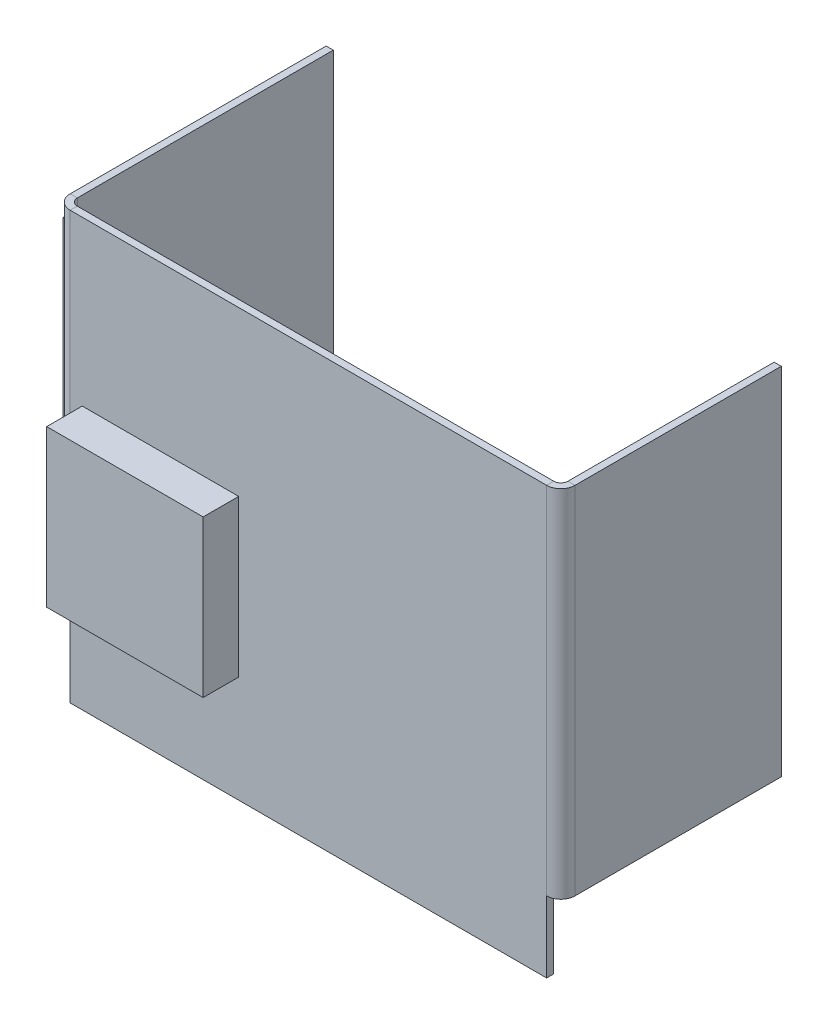
ISO-10303-21;
HEADER;
FILE_DESCRIPTION(('STEP AP214'),'2;1');
FILE_NAME('part.step','',(''),(''),'','','');
FILE_SCHEMA(('AUTOMOTIVE_DESIGN { 1 0 10303 214 1 1 1 1 }'));
ENDSEC;
DATA;
#1=APPLICATION_CONTEXT('core data for automotive mechanical design processes');
#2=APPLICATION_PROTOCOL_DEFINITION('international standard','automotive_design',2000,#1);
#3=PRODUCT_CONTEXT('',#1,'mechanical');
#4=PRODUCT('Part','Part','',(#3));
#5=PRODUCT_RELATED_PRODUCT_CATEGORY('part','',(#4));
#6=PRODUCT_DEFINITION_FORMATION('','',#4);
#7=PRODUCT_DEFINITION_CONTEXT('part definition',#1,'design');
#8=PRODUCT_DEFINITION('design','',#6,#7);
#9=PRODUCT_DEFINITION_SHAPE('','',#8);
#10=(LENGTH_UNIT() NAMED_UNIT(*) SI_UNIT(.MILLI.,.METRE.));
#11=(NAMED_UNIT(*) PLANE_ANGLE_UNIT() SI_UNIT($,.RADIAN.));
#12=(NAMED_UNIT(*) SI_UNIT($,.STERADIAN.) SOLID_ANGLE_UNIT());
#13=UNCERTAINTY_MEASURE_WITH_UNIT(LENGTH_MEASURE(1.E-05),#10,'distance_accuracy_value','');
#14=(GEOMETRIC_REPRESENTATION_CONTEXT(3) GLOBAL_UNCERTAINTY_ASSIGNED_CONTEXT((#13)) GLOBAL_UNIT_ASSIGNED_CONTEXT((#10,
#11,#12)) REPRESENTATION_CONTEXT('',''));
#15=CARTESIAN_POINT('',(0.,0.,0.));
#16=DIRECTION('',(0.,0.,1.));
#17=DIRECTION('',(1.,0.,0.));
#18=AXIS2_PLACEMENT_3D('',#15,#16,#17);
#19=CARTESIAN_POINT('',(-0.1,6.,0.));
#20=DIRECTION('',(-1.,0.,0.));
#21=DIRECTION('',(0.,0.,1.));
#22=AXIS2_PLACEMENT_3D('',#19,#20,#21);
#23=PLANE('',#22);
#24=DIRECTION('',(0.,0.,1.));
#25=VECTOR('',#24,1.);
#26=CARTESIAN_POINT('',(-0.1,1.,-3.7));
#27=LINE('',#26,#25);
#28=CARTESIAN_POINT('',(-0.1,1.,-3.7));
#29=VERTEX_POINT('',#28);
#30=CARTESIAN_POINT('',(-0.0999999999999999,1.,-0.1));
#31=VERTEX_POINT('',#30);
#32=EDGE_CURVE('E266',#29,#31,#27,.T.);
#33=ORIENTED_EDGE('',*,*,#32,.T.);
#34=DIRECTION('',(0.,-1.,0.));
#35=VECTOR('',#34,1.);
#36=CARTESIAN_POINT('',(-0.1,6.,-0.1));
#37=LINE('',#36,#35);
#38=CARTESIAN_POINT('',(-0.1,6.,-0.1));
#39=VERTEX_POINT('',#38);
#40=EDGE_CURVE('E345',#39,#31,#37,.T.);
#41=ORIENTED_EDGE('',*,*,#40,.F.);
#42=DIRECTION('',(0.,0.,-1.));
#43=VECTOR('',#42,1.);
#44=CARTESIAN_POINT('',(-0.1,6.,0.));
#45=LINE('',#44,#43);
#46=CARTESIAN_POINT('',(-0.1,6.,-3.7));
#47=VERTEX_POINT('',#46);
#48=EDGE_CURVE('E282',#39,#47,#45,.T.);
#49=ORIENTED_EDGE('',*,*,#48,.T.);
#50=DIRECTION('',(0.,-1.,0.));
#51=VECTOR('',#50,1.);
#52=CARTESIAN_POINT('',(-0.1,6.,-3.7));
#53=LINE('',#52,#51);
#54=EDGE_CURVE('E348',#47,#29,#53,.T.);
#55=ORIENTED_EDGE('',*,*,#54,.T.);
#56=EDGE_LOOP('',(#33,#41,#49,#55));
#57=FACE_BOUND('',#56,.T.);
#58=DIRECTION('',(0.,0.,1.));
#59=VECTOR('',#58,1.);
#60=CARTESIAN_POINT('',(-0.1,1.06026422059031,-3.5));
#61=LINE('',#60,#59);
#62=CARTESIAN_POINT('',(-0.1,1.06026422059031,-3.5));
#63=VERTEX_POINT('',#62);
#64=CARTESIAN_POINT('',(-0.1,1.06026422059031,-0.5));
#65=VERTEX_POINT('',#64);
#66=EDGE_CURVE('E769',#63,#65,#61,.T.);
#67=ORIENTED_EDGE('',*,*,#66,.F.);
#68=DIRECTION('',(0.,-1.,0.));
#69=VECTOR('',#68,1.);
#70=CARTESIAN_POINT('',(-0.1,5.26026422059031,-3.5));
#71=LINE('',#70,#69);
#72=CARTESIAN_POINT('',(-0.1,5.26026422059031,-3.5));
#73=VERTEX_POINT('',#72);
#74=EDGE_CURVE('E211',#73,#63,#71,.T.);
#75=ORIENTED_EDGE('',*,*,#74,.F.);
#76=DIRECTION('',(0.,0.,-1.));
#77=VECTOR('',#76,1.);
#78=CARTESIAN_POINT('',(-0.1,5.26026422059031,-3.5));
#79=LINE('',#78,#77);
#80=CARTESIAN_POINT('',(-0.1,5.26026422059031,-0.5));
#81=VERTEX_POINT('',#80);
#82=EDGE_CURVE('E207',#81,#73,#79,.T.);
#83=ORIENTED_EDGE('',*,*,#82,.F.);
#84=DIRECTION('',(0.,1.,0.));
#85=VECTOR('',#84,1.);
#86=CARTESIAN_POINT('',(-0.1,5.26026422059031,-0.5));
#87=LINE('',#86,#85);
#88=EDGE_CURVE('E766',#65,#81,#87,.T.);
#89=ORIENTED_EDGE('',*,*,#88,.F.);
#90=EDGE_LOOP('',(#67,#75,#83,#89));
#91=FACE_BOUND('',#90,.T.);
#92=ADVANCED_FACE('F39',(#57,#91),#23,.T.);
#93=CARTESIAN_POINT('',(0.,6.,0.1));
#94=DIRECTION('',(0.,0.,1.));
#95=DIRECTION('',(1.,0.,0.));
#96=AXIS2_PLACEMENT_3D('',#93,#94,#95);
#97=PLANE('',#96);
#98=DIRECTION('',(1.,0.,0.));
#99=VECTOR('',#98,1.);
#100=CARTESIAN_POINT('',(0.,0.,0.1));
#101=LINE('',#100,#99);
#102=CARTESIAN_POINT('',(6.79999999999999,0.,0.1));
#103=VERTEX_POINT('',#102);
#104=CARTESIAN_POINT('',(0.0999999999999998,0.,0.1));
#105=VERTEX_POINT('',#104);
#106=EDGE_CURVE('E275',#103,#105,#101,.F.);
#107=ORIENTED_EDGE('',*,*,#106,.F.);
#108=DIRECTION('',(0.,-1.,0.));
#109=VECTOR('',#108,1.);
#110=CARTESIAN_POINT('',(6.79999999999999,0.,0.1));
#111=LINE('',#110,#109);
#112=CARTESIAN_POINT('',(6.79999999999999,1.,0.1));
#113=VERTEX_POINT('',#112);
#114=EDGE_CURVE('E244',#113,#103,#111,.T.);
#115=ORIENTED_EDGE('',*,*,#114,.F.);
#116=DIRECTION('',(0.,-1.,0.));
#117=VECTOR('',#116,1.);
#118=CARTESIAN_POINT('',(6.79999999999999,6.,0.1));
#119=LINE('',#118,#117);
#120=CARTESIAN_POINT('',(6.79999999999999,6.,0.1));
#121=VERTEX_POINT('',#120);
#122=EDGE_CURVE('E339',#121,#113,#119,.T.);
#123=ORIENTED_EDGE('',*,*,#122,.F.);
#124=DIRECTION('',(1.,0.,0.));
#125=VECTOR('',#124,1.);
#126=CARTESIAN_POINT('',(0.,6.,0.1));
#127=LINE('',#126,#125);
#128=CARTESIAN_POINT('',(0.0999999999999998,6.,0.1));
#129=VERTEX_POINT('',#128);
#130=EDGE_CURVE('E288',#121,#129,#127,.F.);
#131=ORIENTED_EDGE('',*,*,#130,.T.);
#132=DIRECTION('',(0.,-1.,0.));
#133=VECTOR('',#132,1.);
#134=CARTESIAN_POINT('',(0.0999999999999998,6.,0.1));
#135=LINE('',#134,#133);
#136=CARTESIAN_POINT('',(0.0999999999999998,1.,0.1));
#137=VERTEX_POINT('',#136);
#138=EDGE_CURVE('E342',#129,#137,#135,.T.);
#139=ORIENTED_EDGE('',*,*,#138,.T.);
#140=DIRECTION('',(0.,1.,0.));
#141=VECTOR('',#140,1.);
#142=CARTESIAN_POINT('',(0.0999999999999998,0.,0.1));
#143=LINE('',#142,#141);
#144=EDGE_CURVE('E259',#105,#137,#143,.T.);
#145=ORIENTED_EDGE('',*,*,#144,.F.);
#146=EDGE_LOOP('',(#107,#115,#123,#131,#139,#145));
#147=FACE_BOUND('',#146,.T.);
#148=DIRECTION('',(1.,0.,0.));
#149=VECTOR('',#148,1.);
#150=CARTESIAN_POINT('',(0.269926130657873,1.5,0.1));
#151=LINE('',#150,#149);
#152=CARTESIAN_POINT('',(0.269926130657873,1.5,0.1));
#153=VERTEX_POINT('',#152);
#154=CARTESIAN_POINT('',(2.46992613065787,1.5,0.1));
#155=VERTEX_POINT('',#154);
#156=EDGE_CURVE('E216',#153,#155,#151,.T.);
#157=ORIENTED_EDGE('',*,*,#156,.F.);
#158=DIRECTION('',(0.,-1.,0.));
#159=VECTOR('',#158,1.);
#160=CARTESIAN_POINT('',(0.269926130657872,3.7,0.1));
#161=LINE('',#160,#159);
#162=CARTESIAN_POINT('',(0.269926130657872,3.7,0.1));
#163=VERTEX_POINT('',#162);
#164=EDGE_CURVE('E213',#163,#153,#161,.T.);
#165=ORIENTED_EDGE('',*,*,#164,.F.);
#166=DIRECTION('',(-1.,0.,0.));
#167=VECTOR('',#166,1.);
#168=CARTESIAN_POINT('',(0.269926130657872,3.7,0.1));
#169=LINE('',#168,#167);
#170=CARTESIAN_POINT('',(2.46992613065787,3.7,0.1));
#171=VERTEX_POINT('',#170);
#172=EDGE_CURVE('E225',#171,#163,#169,.T.);
#173=ORIENTED_EDGE('',*,*,#172,.F.);
#174=DIRECTION('',(0.,1.,0.));
#175=VECTOR('',#174,1.);
#176=CARTESIAN_POINT('',(2.46992613065787,3.7,0.1));
#177=LINE('',#176,#175);
#178=EDGE_CURVE('E233',#155,#171,#177,.T.);
#179=ORIENTED_EDGE('',*,*,#178,.F.);
#180=EDGE_LOOP('',(#157,#165,#173,#179));
#181=FACE_BOUND('',#180,.T.);
#182=ADVANCED_FACE('F420',(#147,#181),#97,.T.);
#183=CARTESIAN_POINT('',(6.79999999999999,1.,-3.7));
#184=DIRECTION('',(0.,1.,0.));
#185=DIRECTION('',(0.,0.,1.));
#186=AXIS2_PLACEMENT_3D('',#183,#184,#185);
#187=PLANE('',#186);
#188=DIRECTION('',(0.,0.,1.));
#189=VECTOR('',#188,1.);
#190=CARTESIAN_POINT('',(7.,1.,-3.7));
#191=LINE('',#190,#189);
#192=CARTESIAN_POINT('',(7.,1.,-3.));
#193=VERTEX_POINT('',#192);
#194=CARTESIAN_POINT('',(7.,1.,-0.100000000000001));
#195=VERTEX_POINT('',#194);
#196=EDGE_CURVE('E246',#193,#195,#191,.T.);
#197=ORIENTED_EDGE('',*,*,#196,.T.);
#198=DIRECTION('',(-1.,0.,0.));
#199=VECTOR('',#198,1.);
#200=CARTESIAN_POINT('',(7.,1.,-0.100000000000001));
#201=LINE('',#200,#199);
#202=CARTESIAN_POINT('',(6.9,1.,-0.0999999999999998));
#203=VERTEX_POINT('',#202);
#204=EDGE_CURVE('E12',#195,#203,#201,.T.);
#205=ORIENTED_EDGE('',*,*,#204,.T.);
#206=DIRECTION('',(0.,0.,1.));
#207=VECTOR('',#206,1.);
#208=CARTESIAN_POINT('',(6.9,1.,-3.));
#209=LINE('',#208,#207);
#210=CARTESIAN_POINT('',(6.9,1.,-3.));
#211=VERTEX_POINT('',#210);
#212=EDGE_CURVE('E250',#211,#203,#209,.T.);
#213=ORIENTED_EDGE('',*,*,#212,.F.);
#214=DIRECTION('',(1.,0.,0.));
#215=VECTOR('',#214,1.);
#216=CARTESIAN_POINT('',(6.9,1.,-3.));
#217=LINE('',#216,#215);
#218=EDGE_CURVE('E255',#211,#193,#217,.T.);
#219=ORIENTED_EDGE('',*,*,#218,.T.);
#220=EDGE_LOOP('',(#197,#205,#213,#219));
#221=FACE_BOUND('',#220,.T.);
#222=ADVANCED_FACE('F405',(#221),#187,.F.);
#223=CARTESIAN_POINT('',(0.1,6.,0.));
#224=DIRECTION('',(0.,1.,0.));
#225=DIRECTION('',(0.,0.,1.));
#226=AXIS2_PLACEMENT_3D('',#223,#224,#225);
#227=PLANE('',#226);
#228=DIRECTION('',(0.,0.,1.));
#229=VECTOR('',#228,1.);
#230=CARTESIAN_POINT('',(0.1,6.,0.));
#231=LINE('',#230,#229);
#232=CARTESIAN_POINT('',(0.1,6.,0.));
#233=VERTEX_POINT('',#232);
#234=EDGE_CURVE('E366',#233,#129,#231,.T.);
#235=ORIENTED_EDGE('',*,*,#234,.F.);
#236=CARTESIAN_POINT('',(0.1,6.,-0.1));
#237=DIRECTION('',(0.,-1.,0.));
#238=DIRECTION('',(0.,0.,-1.));
#239=AXIS2_PLACEMENT_3D('',#236,#237,#238);
#240=CIRCLE('',#239,0.1);
#241=CARTESIAN_POINT('',(0.,6.,-0.1));
#242=VERTEX_POINT('',#241);
#243=EDGE_CURVE('E309',#233,#242,#240,.T.);
#244=ORIENTED_EDGE('',*,*,#243,.T.);
#245=DIRECTION('',(1.,0.,0.));
#246=VECTOR('',#245,1.);
#247=CARTESIAN_POINT('',(-0.1,6.,-0.1));
#248=LINE('',#247,#246);
#249=EDGE_CURVE('E364',#39,#242,#248,.T.);
#250=ORIENTED_EDGE('',*,*,#249,.F.);
#251=CARTESIAN_POINT('',(0.1,6.,-0.1));
#252=DIRECTION('',(0.,1.,0.));
#253=DIRECTION('',(1.,0.,0.));
#254=AXIS2_PLACEMENT_3D('',#251,#252,#253);
#255=CIRCLE('',#254,0.2);
#256=EDGE_CURVE('E285',#129,#39,#255,.F.);
#257=ORIENTED_EDGE('',*,*,#256,.F.);
#258=EDGE_LOOP('',(#235,#244,#250,#257));
#259=FACE_BOUND('',#258,.T.);
#260=ADVANCED_FACE('F41',(#259),#227,.T.);
#261=CARTESIAN_POINT('',(-0.1,6.,-0.1));
#262=DIRECTION('',(0.,1.,0.));
#263=DIRECTION('',(0.,0.,1.));
#264=AXIS2_PLACEMENT_3D('',#261,#262,#263);
#265=PLANE('',#264);
#266=DIRECTION('',(-1.,0.,0.));
#267=VECTOR('',#266,1.);
#268=CARTESIAN_POINT('',(0.,6.,0.));
#269=LINE('',#268,#267);
#270=CARTESIAN_POINT('',(6.8,6.,0.));
#271=VERTEX_POINT('',#270);
#272=EDGE_CURVE('E306',#271,#233,#269,.T.);
#273=ORIENTED_EDGE('',*,*,#272,.T.);
#274=ORIENTED_EDGE('',*,*,#234,.T.);
#275=ORIENTED_EDGE('',*,*,#130,.F.);
#276=DIRECTION('',(0.,0.,-1.));
#277=VECTOR('',#276,1.);
#278=CARTESIAN_POINT('',(6.79999999999999,6.,0.1));
#279=LINE('',#278,#277);
#280=EDGE_CURVE('E357',#121,#271,#279,.T.);
#281=ORIENTED_EDGE('',*,*,#280,.T.);
#282=EDGE_LOOP('',(#273,#274,#275,#281));
#283=FACE_BOUND('',#282,.T.);
#284=ADVANCED_FACE('F388',(#283),#265,.T.);
#285=CARTESIAN_POINT('',(6.9,6.,-0.0999999999999998));
#286=DIRECTION('',(0.,1.,0.));
#287=DIRECTION('',(0.,0.,1.));
#288=AXIS2_PLACEMENT_3D('',#285,#286,#287);
#289=PLANE('',#288);
#290=DIRECTION('',(1.,0.,0.));
#291=VECTOR('',#290,1.);
#292=CARTESIAN_POINT('',(6.9,6.,-0.0999999999999998));
#293=LINE('',#292,#291);
#294=CARTESIAN_POINT('',(6.9,6.,-0.0999999999999998));
#295=VERTEX_POINT('',#294);
#296=CARTESIAN_POINT('',(7.,6.,-0.1));
#297=VERTEX_POINT('',#296);
#298=EDGE_CURVE('E359',#295,#297,#293,.T.);
#299=ORIENTED_EDGE('',*,*,#298,.F.);
#300=CARTESIAN_POINT('',(6.8,6.,-0.0999999999999997));
#301=DIRECTION('',(0.,-1.,0.));
#302=DIRECTION('',(0.,0.,-1.));
#303=AXIS2_PLACEMENT_3D('',#300,#301,#302);
#304=CIRCLE('',#303,0.1);
#305=EDGE_CURVE('E303',#295,#271,#304,.T.);
#306=ORIENTED_EDGE('',*,*,#305,.T.);
#307=ORIENTED_EDGE('',*,*,#280,.F.);
#308=CARTESIAN_POINT('',(6.8,6.,-0.0999999999999997));
#309=DIRECTION('',(0.,1.,0.));
#310=DIRECTION('',(1.,0.,0.));
#311=AXIS2_PLACEMENT_3D('',#308,#309,#310);
#312=CIRCLE('',#311,0.2);
#313=EDGE_CURVE('E291',#297,#121,#312,.F.);
#314=ORIENTED_EDGE('',*,*,#313,.F.);
#315=EDGE_LOOP('',(#299,#306,#307,#314));
#316=FACE_BOUND('',#315,.T.);
#317=ADVANCED_FACE('F394',(#316),#289,.T.);
#318=CARTESIAN_POINT('',(6.79999999999999,6.,0.1));
#319=DIRECTION('',(0.,1.,0.));
#320=DIRECTION('',(0.,0.,1.));
#321=AXIS2_PLACEMENT_3D('',#318,#319,#320);
#322=PLANE('',#321);
#323=DIRECTION('',(0.,0.,1.));
#324=VECTOR('',#323,1.);
#325=CARTESIAN_POINT('',(6.9,6.,-3.));
#326=LINE('',#325,#324);
#327=CARTESIAN_POINT('',(6.9,6.,-3.));
#328=VERTEX_POINT('',#327);
#329=EDGE_CURVE('E300',#328,#295,#326,.T.);
#330=ORIENTED_EDGE('',*,*,#329,.T.);
#331=ORIENTED_EDGE('',*,*,#298,.T.);
#332=DIRECTION('',(0.,0.,-1.));
#333=VECTOR('',#332,1.);
#334=CARTESIAN_POINT('',(7.,6.,-3.));
#335=LINE('',#334,#333);
#336=CARTESIAN_POINT('',(7.,6.,-3.));
#337=VERTEX_POINT('',#336);
#338=EDGE_CURVE('E294',#337,#297,#335,.F.);
#339=ORIENTED_EDGE('',*,*,#338,.F.);
#340=DIRECTION('',(1.,0.,0.));
#341=VECTOR('',#340,1.);
#342=CARTESIAN_POINT('',(6.9,6.,-3.));
#343=LINE('',#342,#341);
#344=EDGE_CURVE('E297',#328,#337,#343,.T.);
#345=ORIENTED_EDGE('',*,*,#344,.F.);
#346=EDGE_LOOP('',(#330,#331,#339,#345));
#347=FACE_BOUND('',#346,.T.);
#348=ADVANCED_FACE('F400',(#347),#322,.T.);
#349=CARTESIAN_POINT('',(7.,0.,-0.1));
#350=DIRECTION('',(0.,-1.,0.));
#351=DIRECTION('',(0.,0.,-1.));
#352=AXIS2_PLACEMENT_3D('',#349,#350,#351);
#353=PLANE('',#352);
#354=DIRECTION('',(-1.,0.,0.));
#355=VECTOR('',#354,1.);
#356=CARTESIAN_POINT('',(0.,0.,0.));
#357=LINE('',#356,#355);
#358=CARTESIAN_POINT('',(6.8,0.,0.));
#359=VERTEX_POINT('',#358);
#360=CARTESIAN_POINT('',(0.0999999999999998,0.,0.));
#361=VERTEX_POINT('',#360);
#362=EDGE_CURVE('E279',#359,#361,#357,.T.);
#363=ORIENTED_EDGE('',*,*,#362,.F.);
#364=DIRECTION('',(0.,0.,1.));
#365=VECTOR('',#364,1.);
#366=CARTESIAN_POINT('',(6.8,0.,0.));
#367=LINE('',#366,#365);
#368=EDGE_CURVE('E354',#359,#103,#367,.T.);
#369=ORIENTED_EDGE('',*,*,#368,.T.);
#370=ORIENTED_EDGE('',*,*,#106,.T.);
#371=DIRECTION('',(0.,0.,-1.));
#372=VECTOR('',#371,1.);
#373=CARTESIAN_POINT('',(0.0999999999999998,0.,0.1));
#374=LINE('',#373,#372);
#375=EDGE_CURVE('E361',#105,#361,#374,.T.);
#376=ORIENTED_EDGE('',*,*,#375,.T.);
#377=EDGE_LOOP('',(#363,#369,#370,#376));
#378=FACE_BOUND('',#377,.T.);
#379=ADVANCED_FACE('F424',(#378),#353,.T.);
#380=CARTESIAN_POINT('',(0.,6.,0.));
#381=DIRECTION('',(-1.,0.,0.));
#382=DIRECTION('',(0.,0.,1.));
#383=AXIS2_PLACEMENT_3D('',#380,#381,#382);
#384=PLANE('',#383);
#385=DIRECTION('',(0.,-1.,0.));
#386=VECTOR('',#385,1.);
#387=CARTESIAN_POINT('',(0.,6.,-0.1));
#388=LINE('',#387,#386);
#389=CARTESIAN_POINT('',(0.,1.,-0.1));
#390=VERTEX_POINT('',#389);
#391=EDGE_CURVE('E312',#242,#390,#388,.T.);
#392=ORIENTED_EDGE('',*,*,#391,.T.);
#393=DIRECTION('',(0.,0.,-1.));
#394=VECTOR('',#393,1.);
#395=CARTESIAN_POINT('',(0.,1.,0.));
#396=LINE('',#395,#394);
#397=CARTESIAN_POINT('',(0.,1.,-3.7));
#398=VERTEX_POINT('',#397);
#399=EDGE_CURVE('E269',#390,#398,#396,.T.);
#400=ORIENTED_EDGE('',*,*,#399,.T.);
#401=DIRECTION('',(0.,-1.,0.));
#402=VECTOR('',#401,1.);
#403=CARTESIAN_POINT('',(0.,6.,-3.7));
#404=LINE('',#403,#402);
#405=CARTESIAN_POINT('',(0.,6.,-3.7));
#406=VERTEX_POINT('',#405);
#407=EDGE_CURVE('E351',#406,#398,#404,.T.);
#408=ORIENTED_EDGE('',*,*,#407,.F.);
#409=DIRECTION('',(0.,0.,-1.));
#410=VECTOR('',#409,1.);
#411=CARTESIAN_POINT('',(0.,6.,0.));
#412=LINE('',#411,#410);
#413=EDGE_CURVE('E276',#242,#406,#412,.T.);
#414=ORIENTED_EDGE('',*,*,#413,.F.);
#415=EDGE_LOOP('',(#392,#400,#408,#414));
#416=FACE_BOUND('',#415,.T.);
#417=ADVANCED_FACE('F449',(#416),#384,.F.);
#418=CARTESIAN_POINT('',(-0.1,6.,-3.7));
#419=DIRECTION('',(0.,0.,-1.));
#420=DIRECTION('',(-1.,0.,0.));
#421=AXIS2_PLACEMENT_3D('',#418,#419,#420);
#422=PLANE('',#421);
#423=DIRECTION('',(-1.,0.,0.));
#424=VECTOR('',#423,1.);
#425=CARTESIAN_POINT('',(0.0999999999999998,1.,-3.7));
#426=LINE('',#425,#424);
#427=EDGE_CURVE('E260',#398,#29,#426,.T.);
#428=ORIENTED_EDGE('',*,*,#427,.T.);
#429=ORIENTED_EDGE('',*,*,#54,.F.);
#430=DIRECTION('',(1.,0.,0.));
#431=VECTOR('',#430,1.);
#432=CARTESIAN_POINT('',(-0.1,6.,-3.7));
#433=LINE('',#432,#431);
#434=EDGE_CURVE('E278',#47,#406,#433,.T.);
#435=ORIENTED_EDGE('',*,*,#434,.T.);
#436=ORIENTED_EDGE('',*,*,#407,.T.);
#437=EDGE_LOOP('',(#428,#429,#435,#436));
#438=FACE_BOUND('',#437,.T.);
#439=ADVANCED_FACE('F444',(#438),#422,.T.);
#440=CARTESIAN_POINT('',(0.1,6.,-0.1));
#441=DIRECTION('',(0.,-1.,0.));
#442=DIRECTION('',(0.,0.,-1.));
#443=AXIS2_PLACEMENT_3D('',#440,#441,#442);
#444=CYLINDRICAL_SURFACE('',#443,0.2);
#445=CARTESIAN_POINT('',(0.1,1.,-0.1));
#446=DIRECTION('',(0.,1.,0.));
#447=DIRECTION('',(0.,0.,1.));
#448=AXIS2_PLACEMENT_3D('',#445,#446,#447);
#449=CIRCLE('',#448,0.2);
#450=EDGE_CURVE('E273',#137,#31,#449,.F.);
#451=ORIENTED_EDGE('',*,*,#450,.F.);
#452=ORIENTED_EDGE('',*,*,#138,.F.);
#453=ORIENTED_EDGE('',*,*,#256,.T.);
#454=ORIENTED_EDGE('',*,*,#40,.T.);
#455=EDGE_LOOP('',(#451,#452,#453,#454));
#456=FACE_BOUND('',#455,.T.);
#457=ADVANCED_FACE('F436',(#456),#444,.T.);
#458=CARTESIAN_POINT('',(6.8,6.,-0.0999999999999997));
#459=DIRECTION('',(0.,-1.,0.));
#460=DIRECTION('',(0.,0.,-1.));
#461=AXIS2_PLACEMENT_3D('',#458,#459,#460);
#462=CYLINDRICAL_SURFACE('',#461,0.2);
#463=CARTESIAN_POINT('',(6.8,1.,-0.0999999999999997));
#464=DIRECTION('',(0.,1.,0.));
#465=DIRECTION('',(0.,0.,1.));
#466=AXIS2_PLACEMENT_3D('',#463,#464,#465);
#467=CIRCLE('',#466,0.2);
#468=EDGE_CURVE('E257',#195,#113,#467,.F.);
#469=ORIENTED_EDGE('',*,*,#468,.F.);
#470=DIRECTION('',(0.,-1.,0.));
#471=VECTOR('',#470,1.);
#472=CARTESIAN_POINT('',(7.,6.,-0.1));
#473=LINE('',#472,#471);
#474=EDGE_CURVE('E336',#297,#195,#473,.T.);
#475=ORIENTED_EDGE('',*,*,#474,.F.);
#476=ORIENTED_EDGE('',*,*,#313,.T.);
#477=ORIENTED_EDGE('',*,*,#122,.T.);
#478=EDGE_LOOP('',(#469,#475,#476,#477));
#479=FACE_BOUND('',#478,.T.);
#480=ADVANCED_FACE('F413',(#479),#462,.T.);
#481=CARTESIAN_POINT('',(7.,6.,-3.));
#482=DIRECTION('',(1.,0.,0.));
#483=DIRECTION('',(0.,0.,-1.));
#484=AXIS2_PLACEMENT_3D('',#481,#482,#483);
#485=PLANE('',#484);
#486=ORIENTED_EDGE('',*,*,#196,.F.);
#487=DIRECTION('',(0.,-1.,0.));
#488=VECTOR('',#487,1.);
#489=CARTESIAN_POINT('',(7.,6.,-3.));
#490=LINE('',#489,#488);
#491=EDGE_CURVE('E333',#337,#193,#490,.T.);
#492=ORIENTED_EDGE('',*,*,#491,.F.);
#493=ORIENTED_EDGE('',*,*,#338,.T.);
#494=ORIENTED_EDGE('',*,*,#474,.T.);
#495=EDGE_LOOP('',(#486,#492,#493,#494));
#496=FACE_BOUND('',#495,.T.);
#497=ADVANCED_FACE('F410',(#496),#485,.T.);
#498=CARTESIAN_POINT('',(6.9,6.,-3.));
#499=DIRECTION('',(0.,0.,-1.));
#500=DIRECTION('',(-1.,0.,0.));
#501=AXIS2_PLACEMENT_3D('',#498,#499,#500);
#502=PLANE('',#501);
#503=ORIENTED_EDGE('',*,*,#218,.F.);
#504=DIRECTION('',(0.,-1.,0.));
#505=VECTOR('',#504,1.);
#506=CARTESIAN_POINT('',(6.9,6.,-3.));
#507=LINE('',#506,#505);
#508=EDGE_CURVE('E330',#328,#211,#507,.T.);
#509=ORIENTED_EDGE('',*,*,#508,.F.);
#510=ORIENTED_EDGE('',*,*,#344,.T.);
#511=ORIENTED_EDGE('',*,*,#491,.T.);
#512=EDGE_LOOP('',(#503,#509,#510,#511));
#513=FACE_BOUND('',#512,.T.);
#514=ADVANCED_FACE('F408',(#513),#502,.T.);
#515=CARTESIAN_POINT('',(6.9,6.,-3.));
#516=DIRECTION('',(1.,0.,0.));
#517=DIRECTION('',(0.,0.,-1.));
#518=AXIS2_PLACEMENT_3D('',#515,#516,#517);
#519=PLANE('',#518);
#520=ORIENTED_EDGE('',*,*,#508,.T.);
#521=ORIENTED_EDGE('',*,*,#212,.T.);
#522=DIRECTION('',(0.,-1.,0.));
#523=VECTOR('',#522,1.);
#524=CARTESIAN_POINT('',(6.9,6.,-0.0999999999999998));
#525=LINE('',#524,#523);
#526=EDGE_CURVE('E327',#295,#203,#525,.T.);
#527=ORIENTED_EDGE('',*,*,#526,.F.);
#528=ORIENTED_EDGE('',*,*,#329,.F.);
#529=EDGE_LOOP('',(#520,#521,#527,#528));
#530=FACE_BOUND('',#529,.T.);
#531=ADVANCED_FACE('F402',(#530),#519,.F.);
#532=CARTESIAN_POINT('',(6.8,6.,-0.0999999999999997));
#533=DIRECTION('',(0.,-1.,0.));
#534=DIRECTION('',(0.,0.,-1.));
#535=AXIS2_PLACEMENT_3D('',#532,#533,#534);
#536=CYLINDRICAL_SURFACE('',#535,0.1);
#537=ORIENTED_EDGE('',*,*,#526,.T.);
#538=CARTESIAN_POINT('',(6.8,1.,-0.0999999999999997));
#539=DIRECTION('',(0.,1.,0.));
#540=DIRECTION('',(0.,0.,1.));
#541=AXIS2_PLACEMENT_3D('',#538,#539,#540);
#542=CIRCLE('',#541,0.1);
#543=CARTESIAN_POINT('',(6.79999999999999,1.,0.));
#544=VERTEX_POINT('',#543);
#545=EDGE_CURVE('E47',#203,#544,#542,.F.);
#546=ORIENTED_EDGE('',*,*,#545,.T.);
#547=DIRECTION('',(0.,-1.,0.));
#548=VECTOR('',#547,1.);
#549=CARTESIAN_POINT('',(6.8,6.,0.));
#550=LINE('',#549,#548);
#551=EDGE_CURVE('E324',#271,#544,#550,.T.);
#552=ORIENTED_EDGE('',*,*,#551,.F.);
#553=ORIENTED_EDGE('',*,*,#305,.F.);
#554=EDGE_LOOP('',(#537,#546,#552,#553));
#555=FACE_BOUND('',#554,.T.);
#556=ADVANCED_FACE('F374',(#555),#536,.F.);
#557=CARTESIAN_POINT('',(0.,6.,0.));
#558=DIRECTION('',(0.,0.,1.));
#559=DIRECTION('',(1.,0.,0.));
#560=AXIS2_PLACEMENT_3D('',#557,#558,#559);
#561=PLANE('',#560);
#562=ORIENTED_EDGE('',*,*,#362,.T.);
#563=DIRECTION('',(0.,-1.,0.));
#564=VECTOR('',#563,1.);
#565=CARTESIAN_POINT('',(0.1,6.,0.));
#566=LINE('',#565,#564);
#567=CARTESIAN_POINT('',(0.0999999999999998,1.,0.));
#568=VERTEX_POINT('',#567);
#569=EDGE_CURVE('E319',#568,#361,#566,.T.);
#570=ORIENTED_EDGE('',*,*,#569,.F.);
#571=EDGE_CURVE('E320',#233,#568,#566,.T.);
#572=ORIENTED_EDGE('',*,*,#571,.F.);
#573=ORIENTED_EDGE('',*,*,#272,.F.);
#574=ORIENTED_EDGE('',*,*,#551,.T.);
#575=EDGE_CURVE('E323',#544,#359,#550,.T.);
#576=ORIENTED_EDGE('',*,*,#575,.T.);
#577=EDGE_LOOP('',(#562,#570,#572,#573,#574,#576));
#578=FACE_BOUND('',#577,.T.);
#579=ADVANCED_FACE('F382',(#578),#561,.F.);
#580=CARTESIAN_POINT('',(0.1,6.,-0.1));
#581=DIRECTION('',(0.,-1.,0.));
#582=DIRECTION('',(0.,0.,-1.));
#583=AXIS2_PLACEMENT_3D('',#580,#581,#582);
#584=CYLINDRICAL_SURFACE('',#583,0.1);
#585=ORIENTED_EDGE('',*,*,#571,.T.);
#586=CARTESIAN_POINT('',(0.1,1.,-0.1));
#587=DIRECTION('',(0.,1.,0.));
#588=DIRECTION('',(0.,0.,1.));
#589=AXIS2_PLACEMENT_3D('',#586,#587,#588);
#590=CIRCLE('',#589,0.1);
#591=EDGE_CURVE('E368',#568,#390,#590,.F.);
#592=ORIENTED_EDGE('',*,*,#591,.T.);
#593=ORIENTED_EDGE('',*,*,#391,.F.);
#594=ORIENTED_EDGE('',*,*,#243,.F.);
#595=EDGE_LOOP('',(#585,#592,#593,#594));
#596=FACE_BOUND('',#595,.T.);
#597=ADVANCED_FACE('F428',(#596),#584,.F.);
#598=CARTESIAN_POINT('',(0.1,6.,-0.1));
#599=DIRECTION('',(0.,1.,0.));
#600=DIRECTION('',(1.,0.,0.));
#601=AXIS2_PLACEMENT_3D('',#598,#599,#600);
#602=PLANE('',#601);
#603=ORIENTED_EDGE('',*,*,#413,.T.);
#604=ORIENTED_EDGE('',*,*,#434,.F.);
#605=ORIENTED_EDGE('',*,*,#48,.F.);
#606=ORIENTED_EDGE('',*,*,#249,.T.);
#607=EDGE_LOOP('',(#603,#604,#605,#606));
#608=FACE_BOUND('',#607,.T.);
#609=ADVANCED_FACE('F446',(#608),#602,.T.);
#610=CARTESIAN_POINT('',(0.0999999999999998,0.,-3.7));
#611=DIRECTION('',(1.,0.,0.));
#612=DIRECTION('',(0.,0.,-1.));
#613=AXIS2_PLACEMENT_3D('',#610,#611,#612);
#614=PLANE('',#613);
#615=ORIENTED_EDGE('',*,*,#375,.F.);
#616=ORIENTED_EDGE('',*,*,#144,.T.);
#617=DIRECTION('',(0.,0.,1.));
#618=VECTOR('',#617,1.);
#619=CARTESIAN_POINT('',(0.0999999999999998,1.,-3.7));
#620=LINE('',#619,#618);
#621=EDGE_CURVE('E263',#568,#137,#620,.T.);
#622=ORIENTED_EDGE('',*,*,#621,.F.);
#623=ORIENTED_EDGE('',*,*,#569,.T.);
#624=EDGE_LOOP('',(#615,#616,#622,#623));
#625=FACE_BOUND('',#624,.T.);
#626=ADVANCED_FACE('F450',(#625),#614,.F.);
#627=CARTESIAN_POINT('',(0.0999999999999998,1.,-3.7));
#628=DIRECTION('',(0.,1.,0.));
#629=DIRECTION('',(0.,0.,1.));
#630=AXIS2_PLACEMENT_3D('',#627,#628,#629);
#631=PLANE('',#630);
#632=ORIENTED_EDGE('',*,*,#450,.T.);
#633=ORIENTED_EDGE('',*,*,#32,.F.);
#634=ORIENTED_EDGE('',*,*,#427,.F.);
#635=ORIENTED_EDGE('',*,*,#399,.F.);
#636=ORIENTED_EDGE('',*,*,#591,.F.);
#637=ORIENTED_EDGE('',*,*,#621,.T.);
#638=EDGE_LOOP('',(#632,#633,#634,#635,#636,#637));
#639=FACE_BOUND('',#638,.T.);
#640=ADVANCED_FACE('F438',(#639),#631,.F.);
#641=CARTESIAN_POINT('',(6.79999999999999,0.,-3.7));
#642=DIRECTION('',(-1.,0.,0.));
#643=DIRECTION('',(0.,0.,1.));
#644=AXIS2_PLACEMENT_3D('',#641,#642,#643);
#645=PLANE('',#644);
#646=DIRECTION('',(0.,0.,1.));
#647=VECTOR('',#646,1.);
#648=CARTESIAN_POINT('',(6.79999999999999,1.,-3.7));
#649=LINE('',#648,#647);
#650=EDGE_CURVE('E247',#544,#113,#649,.T.);
#651=ORIENTED_EDGE('',*,*,#650,.T.);
#652=ORIENTED_EDGE('',*,*,#114,.T.);
#653=ORIENTED_EDGE('',*,*,#368,.F.);
#654=ORIENTED_EDGE('',*,*,#575,.F.);
#655=EDGE_LOOP('',(#651,#652,#653,#654));
#656=FACE_BOUND('',#655,.T.);
#657=ADVANCED_FACE('F417',(#656),#645,.F.);
#658=ORIENTED_EDGE('',*,*,#204,.F.);
#659=ORIENTED_EDGE('',*,*,#468,.T.);
#660=ORIENTED_EDGE('',*,*,#650,.F.);
#661=ORIENTED_EDGE('',*,*,#545,.F.);
#662=EDGE_LOOP('',(#658,#659,#660,#661));
#663=FACE_BOUND('',#662,.T.);
#664=ADVANCED_FACE('F414',(#663),#187,.F.);
#665=CARTESIAN_POINT('',(0.269926130657872,3.7,0.6));
#666=DIRECTION('',(1.,0.,0.));
#667=DIRECTION('',(0.,1.,0.));
#668=AXIS2_PLACEMENT_3D('',#665,#666,#667);
#669=PLANE('',#668);
#670=ORIENTED_EDGE('',*,*,#164,.T.);
#671=DIRECTION('',(0.,0.,-1.));
#672=VECTOR('',#671,1.);
#673=CARTESIAN_POINT('',(0.269926130657873,1.5,0.6));
#674=LINE('',#673,#672);
#675=CARTESIAN_POINT('',(0.269926130657873,1.5,0.6));
#676=VERTEX_POINT('',#675);
#677=EDGE_CURVE('E242',#676,#153,#674,.T.);
#678=ORIENTED_EDGE('',*,*,#677,.F.);
#679=DIRECTION('',(0.,-1.,0.));
#680=VECTOR('',#679,1.);
#681=CARTESIAN_POINT('',(0.269926130657872,3.7,0.6));
#682=LINE('',#681,#680);
#683=CARTESIAN_POINT('',(0.269926130657872,3.7,0.6));
#684=VERTEX_POINT('',#683);
#685=EDGE_CURVE('E221',#684,#676,#682,.T.);
#686=ORIENTED_EDGE('',*,*,#685,.F.);
#687=DIRECTION('',(0.,0.,-1.));
#688=VECTOR('',#687,1.);
#689=CARTESIAN_POINT('',(0.269926130657872,3.7,0.6));
#690=LINE('',#689,#688);
#691=EDGE_CURVE('E230',#684,#163,#690,.T.);
#692=ORIENTED_EDGE('',*,*,#691,.T.);
#693=EDGE_LOOP('',(#670,#678,#686,#692));
#694=FACE_BOUND('',#693,.T.);
#695=ADVANCED_FACE('F491',(#694),#669,.F.);
#696=CARTESIAN_POINT('',(0.269926130657873,1.5,0.6));
#697=DIRECTION('',(0.,1.,0.));
#698=DIRECTION('',(0.,0.,1.));
#699=AXIS2_PLACEMENT_3D('',#696,#697,#698);
#700=PLANE('',#699);
#701=ORIENTED_EDGE('',*,*,#156,.T.);
#702=DIRECTION('',(0.,0.,-1.));
#703=VECTOR('',#702,1.);
#704=CARTESIAN_POINT('',(2.46992613065787,1.5,0.6));
#705=LINE('',#704,#703);
#706=CARTESIAN_POINT('',(2.46992613065787,1.5,0.6));
#707=VERTEX_POINT('',#706);
#708=EDGE_CURVE('E239',#707,#155,#705,.T.);
#709=ORIENTED_EDGE('',*,*,#708,.F.);
#710=DIRECTION('',(1.,0.,0.));
#711=VECTOR('',#710,1.);
#712=CARTESIAN_POINT('',(0.269926130657873,1.5,0.6));
#713=LINE('',#712,#711);
#714=EDGE_CURVE('E224',#676,#707,#713,.T.);
#715=ORIENTED_EDGE('',*,*,#714,.F.);
#716=ORIENTED_EDGE('',*,*,#677,.T.);
#717=EDGE_LOOP('',(#701,#709,#715,#716));
#718=FACE_BOUND('',#717,.T.);
#719=ADVANCED_FACE('F497',(#718),#700,.F.);
#720=CARTESIAN_POINT('',(2.46992613065787,3.7,0.6));
#721=DIRECTION('',(-1.,0.,0.));
#722=DIRECTION('',(0.,-1.,0.));
#723=AXIS2_PLACEMENT_3D('',#720,#721,#722);
#724=PLANE('',#723);
#725=ORIENTED_EDGE('',*,*,#178,.T.);
#726=DIRECTION('',(0.,0.,-1.));
#727=VECTOR('',#726,1.);
#728=CARTESIAN_POINT('',(2.46992613065787,3.7,0.6));
#729=LINE('',#728,#727);
#730=CARTESIAN_POINT('',(2.46992613065787,3.7,0.6));
#731=VERTEX_POINT('',#730);
#732=EDGE_CURVE('E62',#731,#171,#729,.T.);
#733=ORIENTED_EDGE('',*,*,#732,.F.);
#734=DIRECTION('',(0.,1.,0.));
#735=VECTOR('',#734,1.);
#736=CARTESIAN_POINT('',(2.46992613065787,3.7,0.6));
#737=LINE('',#736,#735);
#738=EDGE_CURVE('E227',#707,#731,#737,.T.);
#739=ORIENTED_EDGE('',*,*,#738,.F.);
#740=ORIENTED_EDGE('',*,*,#708,.T.);
#741=EDGE_LOOP('',(#725,#733,#739,#740));
#742=FACE_BOUND('',#741,.T.);
#743=ADVANCED_FACE('F728',(#742),#724,.F.);
#744=CARTESIAN_POINT('',(0.269926130657872,3.7,0.6));
#745=DIRECTION('',(0.,-1.,0.));
#746=DIRECTION('',(0.,0.,-1.));
#747=AXIS2_PLACEMENT_3D('',#744,#745,#746);
#748=PLANE('',#747);
#749=ORIENTED_EDGE('',*,*,#172,.T.);
#750=ORIENTED_EDGE('',*,*,#691,.F.);
#751=DIRECTION('',(-1.,0.,0.));
#752=VECTOR('',#751,1.);
#753=CARTESIAN_POINT('',(0.269926130657872,3.7,0.6));
#754=LINE('',#753,#752);
#755=EDGE_CURVE('E229',#731,#684,#754,.T.);
#756=ORIENTED_EDGE('',*,*,#755,.F.);
#757=ORIENTED_EDGE('',*,*,#732,.T.);
#758=EDGE_LOOP('',(#749,#750,#756,#757));
#759=FACE_BOUND('',#758,.T.);
#760=ADVANCED_FACE('F721',(#759),#748,.F.);
#761=CARTESIAN_POINT('',(0.,0.,0.6));
#762=DIRECTION('',(0.,0.,1.));
#763=DIRECTION('',(1.,0.,0.));
#764=AXIS2_PLACEMENT_3D('',#761,#762,#763);
#765=PLANE('',#764);
#766=ORIENTED_EDGE('',*,*,#685,.T.);
#767=ORIENTED_EDGE('',*,*,#714,.T.);
#768=ORIENTED_EDGE('',*,*,#738,.T.);
#769=ORIENTED_EDGE('',*,*,#755,.T.);
#770=EDGE_LOOP('',(#766,#767,#768,#769));
#771=FACE_BOUND('',#770,.T.);
#772=ADVANCED_FACE('F673',(#771),#765,.T.);
#773=CARTESIAN_POINT('',(-0.6,5.26026422059031,-3.5));
#774=DIRECTION('',(0.,0.,1.));
#775=DIRECTION('',(0.,-1.,0.));
#776=AXIS2_PLACEMENT_3D('',#773,#774,#775);
#777=PLANE('',#776);
#778=ORIENTED_EDGE('',*,*,#74,.T.);
#779=DIRECTION('',(1.,0.,0.));
#780=VECTOR('',#779,1.);
#781=CARTESIAN_POINT('',(-0.6,1.06026422059031,-3.5));
#782=LINE('',#781,#780);
#783=CARTESIAN_POINT('',(-0.6,1.06026422059031,-3.5));
#784=VERTEX_POINT('',#783);
#785=EDGE_CURVE('E192',#784,#63,#782,.T.);
#786=ORIENTED_EDGE('',*,*,#785,.F.);
#787=DIRECTION('',(0.,-1.,0.));
#788=VECTOR('',#787,1.);
#789=CARTESIAN_POINT('',(-0.6,5.26026422059031,-3.5));
#790=LINE('',#789,#788);
#791=CARTESIAN_POINT('',(-0.6,5.26026422059031,-3.5));
#792=VERTEX_POINT('',#791);
#793=EDGE_CURVE('E199',#792,#784,#790,.T.);
#794=ORIENTED_EDGE('',*,*,#793,.F.);
#795=DIRECTION('',(1.,0.,0.));
#796=VECTOR('',#795,1.);
#797=CARTESIAN_POINT('',(-0.6,5.26026422059031,-3.5));
#798=LINE('',#797,#796);
#799=EDGE_CURVE('E764',#792,#73,#798,.T.);
#800=ORIENTED_EDGE('',*,*,#799,.T.);
#801=EDGE_LOOP('',(#778,#786,#794,#800));
#802=FACE_BOUND('',#801,.T.);
#803=ADVANCED_FACE('F209',(#802),#777,.F.);
#804=CARTESIAN_POINT('',(-0.6,1.06026422059031,-3.5));
#805=DIRECTION('',(0.,1.,0.));
#806=DIRECTION('',(0.,0.,1.));
#807=AXIS2_PLACEMENT_3D('',#804,#805,#806);
#808=PLANE('',#807);
#809=ORIENTED_EDGE('',*,*,#66,.T.);
#810=DIRECTION('',(1.,0.,0.));
#811=VECTOR('',#810,1.);
#812=CARTESIAN_POINT('',(-0.6,1.06026422059031,-0.5));
#813=LINE('',#812,#811);
#814=CARTESIAN_POINT('',(-0.6,1.06026422059031,-0.5));
#815=VERTEX_POINT('',#814);
#816=EDGE_CURVE('E195',#815,#65,#813,.T.);
#817=ORIENTED_EDGE('',*,*,#816,.F.);
#818=DIRECTION('',(0.,0.,1.));
#819=VECTOR('',#818,1.);
#820=CARTESIAN_POINT('',(-0.6,1.06026422059031,-3.5));
#821=LINE('',#820,#819);
#822=EDGE_CURVE('E188',#784,#815,#821,.T.);
#823=ORIENTED_EDGE('',*,*,#822,.F.);
#824=ORIENTED_EDGE('',*,*,#785,.T.);
#825=EDGE_LOOP('',(#809,#817,#823,#824));
#826=FACE_BOUND('',#825,.T.);
#827=ADVANCED_FACE('F190',(#826),#808,.F.);
#828=CARTESIAN_POINT('',(-0.6,5.26026422059031,-0.5));
#829=DIRECTION('',(0.,0.,-1.));
#830=DIRECTION('',(0.,1.,0.));
#831=AXIS2_PLACEMENT_3D('',#828,#829,#830);
#832=PLANE('',#831);
#833=ORIENTED_EDGE('',*,*,#88,.T.);
#834=DIRECTION('',(1.,0.,0.));
#835=VECTOR('',#834,1.);
#836=CARTESIAN_POINT('',(-0.6,5.26026422059031,-0.5));
#837=LINE('',#836,#835);
#838=CARTESIAN_POINT('',(-0.6,5.26026422059031,-0.5));
#839=VERTEX_POINT('',#838);
#840=EDGE_CURVE('E54',#839,#81,#837,.T.);
#841=ORIENTED_EDGE('',*,*,#840,.F.);
#842=DIRECTION('',(0.,1.,0.));
#843=VECTOR('',#842,1.);
#844=CARTESIAN_POINT('',(-0.6,5.26026422059031,-0.5));
#845=LINE('',#844,#843);
#846=EDGE_CURVE('E198',#815,#839,#845,.T.);
#847=ORIENTED_EDGE('',*,*,#846,.F.);
#848=ORIENTED_EDGE('',*,*,#816,.T.);
#849=EDGE_LOOP('',(#833,#841,#847,#848));
#850=FACE_BOUND('',#849,.T.);
#851=ADVANCED_FACE('F688',(#850),#832,.F.);
#852=CARTESIAN_POINT('',(-0.6,5.26026422059031,-3.5));
#853=DIRECTION('',(0.,-1.,0.));
#854=DIRECTION('',(0.,0.,-1.));
#855=AXIS2_PLACEMENT_3D('',#852,#853,#854);
#856=PLANE('',#855);
#857=ORIENTED_EDGE('',*,*,#82,.T.);
#858=ORIENTED_EDGE('',*,*,#799,.F.);
#859=DIRECTION('',(0.,0.,-1.));
#860=VECTOR('',#859,1.);
#861=CARTESIAN_POINT('',(-0.6,5.26026422059031,-3.5));
#862=LINE('',#861,#860);
#863=EDGE_CURVE('E203',#839,#792,#862,.T.);
#864=ORIENTED_EDGE('',*,*,#863,.F.);
#865=ORIENTED_EDGE('',*,*,#840,.T.);
#866=EDGE_LOOP('',(#857,#858,#864,#865));
#867=FACE_BOUND('',#866,.T.);
#868=ADVANCED_FACE('F696',(#867),#856,.F.);
#869=CARTESIAN_POINT('',(-0.6,0.,0.));
#870=DIRECTION('',(-1.,0.,0.));
#871=DIRECTION('',(0.,0.,1.));
#872=AXIS2_PLACEMENT_3D('',#869,#870,#871);
#873=PLANE('',#872);
#874=ORIENTED_EDGE('',*,*,#793,.T.);
#875=ORIENTED_EDGE('',*,*,#822,.T.);
#876=ORIENTED_EDGE('',*,*,#846,.T.);
#877=ORIENTED_EDGE('',*,*,#863,.T.);
#878=EDGE_LOOP('',(#874,#875,#876,#877));
#879=FACE_BOUND('',#878,.T.);
#880=ADVANCED_FACE('F202',(#879),#873,.T.);
#881=CLOSED_SHELL('',(#92,#182,#222,#260,#284,#317,#348,#379,#417,#439,#457,#480,#497,#514,#531,
#556,#579,#597,#609,#626,#640,#657,#664,#695,#719,#743,#760,#772,#803,#827,#851,#868,#880));
#882=MANIFOLD_SOLID_BREP('B2',#881);
#883=ADVANCED_BREP_SHAPE_REPRESENTATION('',(#18,#882),#14);
#884=SHAPE_DEFINITION_REPRESENTATION(#9,#883);
ENDSEC;
END-ISO-10303-21;
